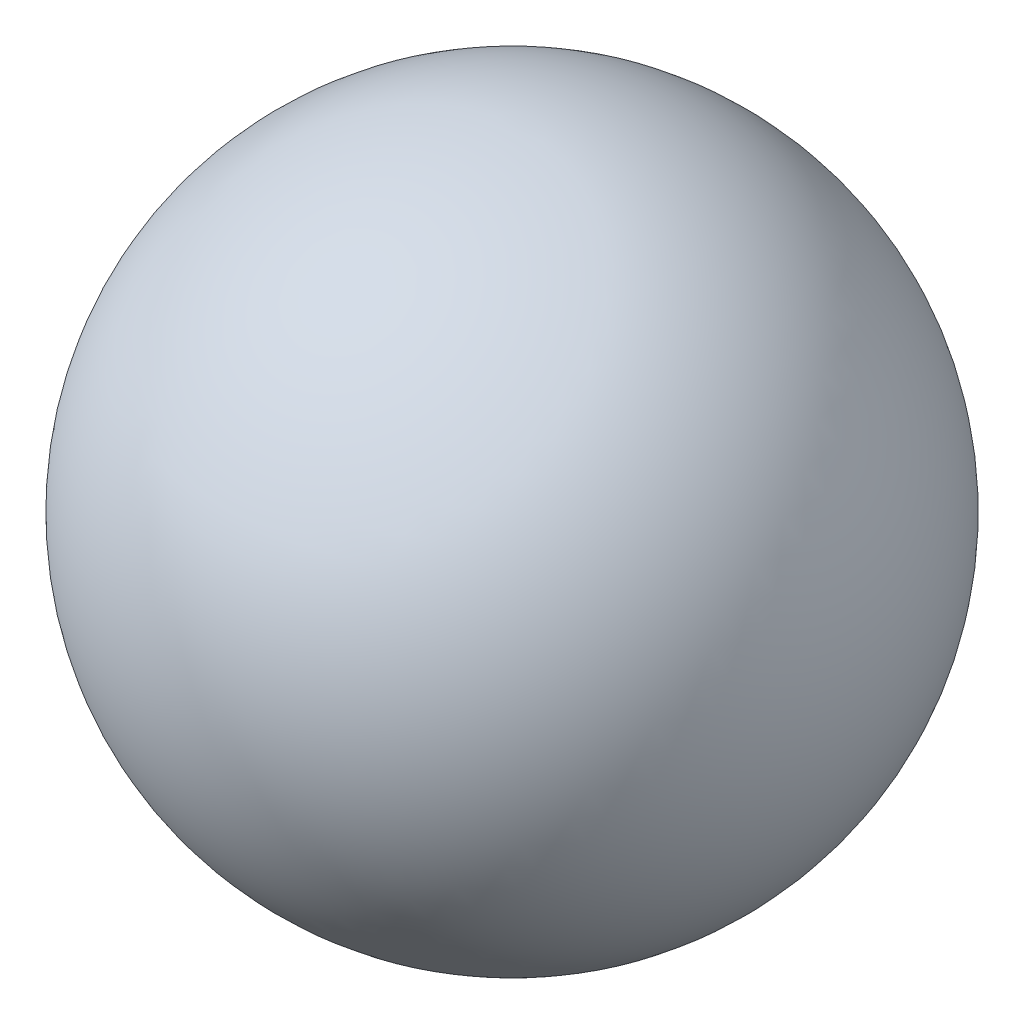
ISO-10303-21;
HEADER;
FILE_DESCRIPTION(('STEP AP214'),'2;1');
FILE_NAME('part.step','',(''),(''),'','','');
FILE_SCHEMA(('AUTOMOTIVE_DESIGN { 1 0 10303 214 1 1 1 1 }'));
ENDSEC;
DATA;
#1=APPLICATION_CONTEXT('core data for automotive mechanical design processes');
#2=APPLICATION_PROTOCOL_DEFINITION('international standard','automotive_design',2000,#1);
#3=PRODUCT_CONTEXT('',#1,'mechanical');
#4=PRODUCT('Part','Part','',(#3));
#5=PRODUCT_RELATED_PRODUCT_CATEGORY('part','',(#4));
#6=PRODUCT_DEFINITION_FORMATION('','',#4);
#7=PRODUCT_DEFINITION_CONTEXT('part definition',#1,'design');
#8=PRODUCT_DEFINITION('design','',#6,#7);
#9=PRODUCT_DEFINITION_SHAPE('','',#8);
#10=(LENGTH_UNIT() NAMED_UNIT(*) SI_UNIT(.MILLI.,.METRE.));
#11=(NAMED_UNIT(*) PLANE_ANGLE_UNIT() SI_UNIT($,.RADIAN.));
#12=(NAMED_UNIT(*) SI_UNIT($,.STERADIAN.) SOLID_ANGLE_UNIT());
#13=UNCERTAINTY_MEASURE_WITH_UNIT(LENGTH_MEASURE(1.E-05),#10,'distance_accuracy_value','');
#14=(GEOMETRIC_REPRESENTATION_CONTEXT(3) GLOBAL_UNCERTAINTY_ASSIGNED_CONTEXT((#13)) GLOBAL_UNIT_ASSIGNED_CONTEXT((#10,
#11,#12)) REPRESENTATION_CONTEXT('',''));
#15=CARTESIAN_POINT('',(0.,0.,0.));
#16=DIRECTION('',(0.,0.,1.));
#17=DIRECTION('',(1.,0.,0.));
#18=AXIS2_PLACEMENT_3D('',#15,#16,#17);
#19=CARTESIAN_POINT('',(0.,0.,0.));
#20=DIRECTION('',(0.,1.,0.));
#21=DIRECTION('',(1.,0.,0.));
#22=AXIS2_PLACEMENT_3D('',#19,#20,#21);
#23=SPHERICAL_SURFACE('',#22,32.5);
#24=CARTESIAN_POINT('',(0.,32.5,0.));
#25=VERTEX_POINT('',#24);
#26=VERTEX_LOOP('',#25);
#27=FACE_BOUND('',#26,.T.);
#28=ADVANCED_FACE('F35',(#27),#23,.T.);
#29=CLOSED_SHELL('',(#28));
#30=MANIFOLD_SOLID_BREP('B2',#29);
#31=ADVANCED_BREP_SHAPE_REPRESENTATION('',(#18,#30),#14);
#32=SHAPE_DEFINITION_REPRESENTATION(#9,#31);
ENDSEC;
END-ISO-10303-21;
